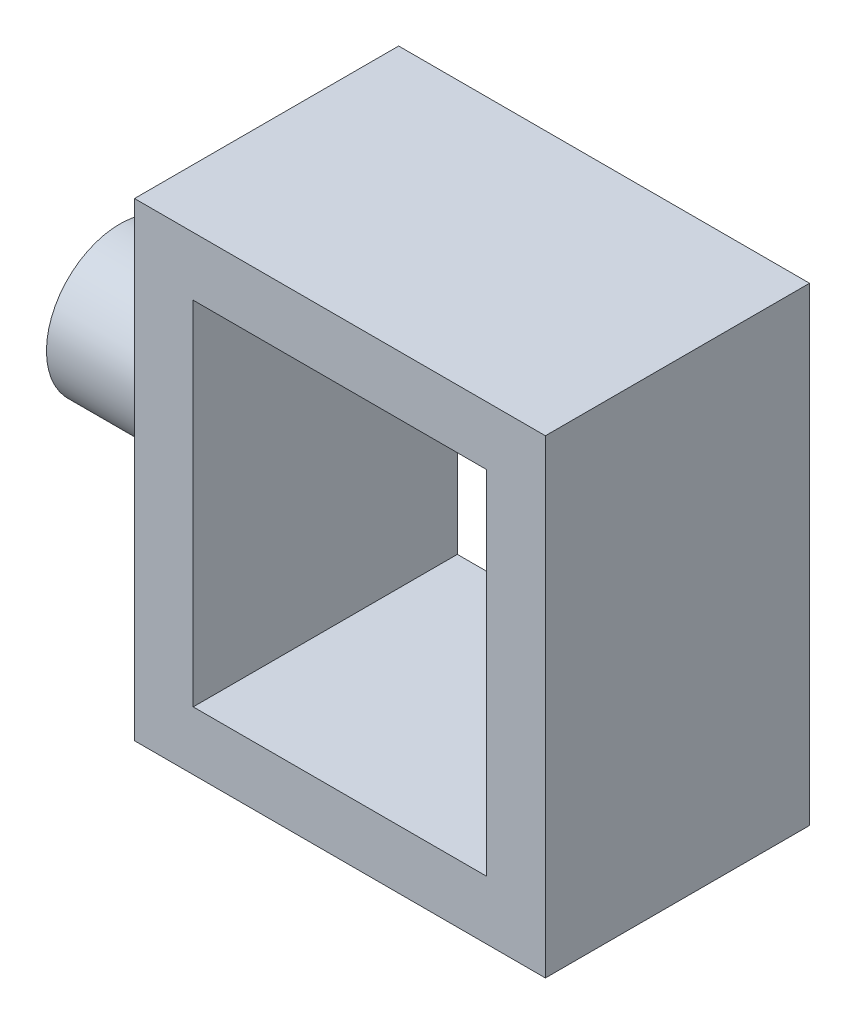
ISO-10303-21;
HEADER;
FILE_DESCRIPTION(('STEP AP214'),'2;1');
FILE_NAME('part.step','',(''),(''),'','','');
FILE_SCHEMA(('AUTOMOTIVE_DESIGN { 1 0 10303 214 1 1 1 1 }'));
ENDSEC;
DATA;
#1=APPLICATION_CONTEXT('core data for automotive mechanical design processes');
#2=APPLICATION_PROTOCOL_DEFINITION('international standard','automotive_design',2000,#1);
#3=PRODUCT_CONTEXT('',#1,'mechanical');
#4=PRODUCT('Part','Part','',(#3));
#5=PRODUCT_RELATED_PRODUCT_CATEGORY('part','',(#4));
#6=PRODUCT_DEFINITION_FORMATION('','',#4);
#7=PRODUCT_DEFINITION_CONTEXT('part definition',#1,'design');
#8=PRODUCT_DEFINITION('design','',#6,#7);
#9=PRODUCT_DEFINITION_SHAPE('','',#8);
#10=(LENGTH_UNIT() NAMED_UNIT(*) SI_UNIT(.MILLI.,.METRE.));
#11=(NAMED_UNIT(*) PLANE_ANGLE_UNIT() SI_UNIT($,.RADIAN.));
#12=(NAMED_UNIT(*) SI_UNIT($,.STERADIAN.) SOLID_ANGLE_UNIT());
#13=UNCERTAINTY_MEASURE_WITH_UNIT(LENGTH_MEASURE(1.E-05),#10,'distance_accuracy_value','');
#14=(GEOMETRIC_REPRESENTATION_CONTEXT(3) GLOBAL_UNCERTAINTY_ASSIGNED_CONTEXT((#13)) GLOBAL_UNIT_ASSIGNED_CONTEXT((#10,
#11,#12)) REPRESENTATION_CONTEXT('',''));
#15=CARTESIAN_POINT('',(0.,0.,0.));
#16=DIRECTION('',(0.,0.,1.));
#17=DIRECTION('',(1.,0.,0.));
#18=AXIS2_PLACEMENT_3D('',#15,#16,#17);
#19=CARTESIAN_POINT('',(0.,0.,9.));
#20=DIRECTION('',(0.,0.,1.));
#21=DIRECTION('',(1.,0.,0.));
#22=AXIS2_PLACEMENT_3D('',#19,#20,#21);
#23=PLANE('',#22);
#24=DIRECTION('',(0.,1.,0.));
#25=VECTOR('',#24,1.);
#26=CARTESIAN_POINT('',(0.,0.,9.));
#27=LINE('',#26,#25);
#28=CARTESIAN_POINT('',(0.,0.,9.));
#29=VERTEX_POINT('',#28);
#30=CARTESIAN_POINT('',(0.,16.,9.));
#31=VERTEX_POINT('',#30);
#32=EDGE_CURVE('E137',#29,#31,#27,.T.);
#33=ORIENTED_EDGE('',*,*,#32,.T.);
#34=DIRECTION('',(-1.,0.,0.));
#35=VECTOR('',#34,1.);
#36=CARTESIAN_POINT('',(0.,16.,9.));
#37=LINE('',#36,#35);
#38=CARTESIAN_POINT('',(-14.,16.,9.));
#39=VERTEX_POINT('',#38);
#40=EDGE_CURVE('E140',#31,#39,#37,.T.);
#41=ORIENTED_EDGE('',*,*,#40,.T.);
#42=DIRECTION('',(0.,-1.,0.));
#43=VECTOR('',#42,1.);
#44=CARTESIAN_POINT('',(-14.,0.,9.));
#45=LINE('',#44,#43);
#46=CARTESIAN_POINT('',(-14.,0.,9.));
#47=VERTEX_POINT('',#46);
#48=EDGE_CURVE('E143',#39,#47,#45,.T.);
#49=ORIENTED_EDGE('',*,*,#48,.T.);
#50=DIRECTION('',(1.,0.,0.));
#51=VECTOR('',#50,1.);
#52=CARTESIAN_POINT('',(0.,0.,9.));
#53=LINE('',#52,#51);
#54=EDGE_CURVE('E145',#47,#29,#53,.T.);
#55=ORIENTED_EDGE('',*,*,#54,.T.);
#56=EDGE_LOOP('',(#33,#41,#49,#55));
#57=FACE_BOUND('',#56,.T.);
#58=DIRECTION('',(1.,0.,0.));
#59=VECTOR('',#58,1.);
#60=CARTESIAN_POINT('',(-12.,2.,9.));
#61=LINE('',#60,#59);
#62=CARTESIAN_POINT('',(-12.,2.,9.));
#63=VERTEX_POINT('',#62);
#64=CARTESIAN_POINT('',(-1.99999999999999,2.,9.));
#65=VERTEX_POINT('',#64);
#66=EDGE_CURVE('E108',#63,#65,#61,.T.);
#67=ORIENTED_EDGE('',*,*,#66,.F.);
#68=DIRECTION('',(0.,-1.,0.));
#69=VECTOR('',#68,1.);
#70=CARTESIAN_POINT('',(-12.,14.,9.));
#71=LINE('',#70,#69);
#72=CARTESIAN_POINT('',(-12.,14.,9.));
#73=VERTEX_POINT('',#72);
#74=EDGE_CURVE('E100',#73,#63,#71,.T.);
#75=ORIENTED_EDGE('',*,*,#74,.F.);
#76=DIRECTION('',(-1.,0.,0.));
#77=VECTOR('',#76,1.);
#78=CARTESIAN_POINT('',(-12.,14.,9.));
#79=LINE('',#78,#77);
#80=CARTESIAN_POINT('',(-1.99999999999999,14.,9.));
#81=VERTEX_POINT('',#80);
#82=EDGE_CURVE('E122',#81,#73,#79,.T.);
#83=ORIENTED_EDGE('',*,*,#82,.F.);
#84=DIRECTION('',(0.,1.,0.));
#85=VECTOR('',#84,1.);
#86=CARTESIAN_POINT('',(-1.99999999999999,14.,9.));
#87=LINE('',#86,#85);
#88=EDGE_CURVE('E120',#65,#81,#87,.T.);
#89=ORIENTED_EDGE('',*,*,#88,.F.);
#90=EDGE_LOOP('',(#67,#75,#83,#89));
#91=FACE_BOUND('',#90,.T.);
#92=ADVANCED_FACE('F34',(#57,#91),#23,.T.);
#93=CARTESIAN_POINT('',(0.,0.,0.));
#94=DIRECTION('',(0.,0.,1.));
#95=DIRECTION('',(1.,0.,0.));
#96=AXIS2_PLACEMENT_3D('',#93,#94,#95);
#97=PLANE('',#96);
#98=DIRECTION('',(0.,1.,0.));
#99=VECTOR('',#98,1.);
#100=CARTESIAN_POINT('',(0.,0.,0.));
#101=LINE('',#100,#99);
#102=CARTESIAN_POINT('',(0.,0.,0.));
#103=VERTEX_POINT('',#102);
#104=CARTESIAN_POINT('',(0.,16.,0.));
#105=VERTEX_POINT('',#104);
#106=EDGE_CURVE('E116',#103,#105,#101,.T.);
#107=ORIENTED_EDGE('',*,*,#106,.F.);
#108=DIRECTION('',(1.,0.,0.));
#109=VECTOR('',#108,1.);
#110=CARTESIAN_POINT('',(0.,0.,0.));
#111=LINE('',#110,#109);
#112=CARTESIAN_POINT('',(-14.,0.,0.));
#113=VERTEX_POINT('',#112);
#114=EDGE_CURVE('E141',#113,#103,#111,.T.);
#115=ORIENTED_EDGE('',*,*,#114,.F.);
#116=DIRECTION('',(0.,-1.,0.));
#117=VECTOR('',#116,1.);
#118=CARTESIAN_POINT('',(-14.,0.,0.));
#119=LINE('',#118,#117);
#120=CARTESIAN_POINT('',(-14.,16.,0.));
#121=VERTEX_POINT('',#120);
#122=EDGE_CURVE('E152',#121,#113,#119,.T.);
#123=ORIENTED_EDGE('',*,*,#122,.F.);
#124=DIRECTION('',(-1.,0.,0.));
#125=VECTOR('',#124,1.);
#126=CARTESIAN_POINT('',(0.,16.,0.));
#127=LINE('',#126,#125);
#128=EDGE_CURVE('E150',#105,#121,#127,.T.);
#129=ORIENTED_EDGE('',*,*,#128,.F.);
#130=EDGE_LOOP('',(#107,#115,#123,#129));
#131=FACE_BOUND('',#130,.T.);
#132=DIRECTION('',(0.,-1.,0.));
#133=VECTOR('',#132,1.);
#134=CARTESIAN_POINT('',(-12.,14.,0.));
#135=LINE('',#134,#133);
#136=CARTESIAN_POINT('',(-12.,14.,0.));
#137=VERTEX_POINT('',#136);
#138=CARTESIAN_POINT('',(-12.,2.,0.));
#139=VERTEX_POINT('',#138);
#140=EDGE_CURVE('E58',#137,#139,#135,.T.);
#141=ORIENTED_EDGE('',*,*,#140,.T.);
#142=DIRECTION('',(1.,0.,0.));
#143=VECTOR('',#142,1.);
#144=CARTESIAN_POINT('',(-12.,2.,0.));
#145=LINE('',#144,#143);
#146=CARTESIAN_POINT('',(-1.99999999999999,2.,0.));
#147=VERTEX_POINT('',#146);
#148=EDGE_CURVE('E115',#139,#147,#145,.T.);
#149=ORIENTED_EDGE('',*,*,#148,.T.);
#150=DIRECTION('',(0.,1.,0.));
#151=VECTOR('',#150,1.);
#152=CARTESIAN_POINT('',(-1.99999999999999,14.,0.));
#153=LINE('',#152,#151);
#154=CARTESIAN_POINT('',(-1.99999999999999,14.,0.));
#155=VERTEX_POINT('',#154);
#156=EDGE_CURVE('E129',#147,#155,#153,.T.);
#157=ORIENTED_EDGE('',*,*,#156,.T.);
#158=DIRECTION('',(-1.,0.,0.));
#159=VECTOR('',#158,1.);
#160=CARTESIAN_POINT('',(-12.,14.,0.));
#161=LINE('',#160,#159);
#162=EDGE_CURVE('E109',#155,#137,#161,.T.);
#163=ORIENTED_EDGE('',*,*,#162,.T.);
#164=EDGE_LOOP('',(#141,#149,#157,#163));
#165=FACE_BOUND('',#164,.T.);
#166=ADVANCED_FACE('F175',(#131,#165),#97,.F.);
#167=CARTESIAN_POINT('',(0.,0.,9.));
#168=DIRECTION('',(-1.,0.,0.));
#169=DIRECTION('',(0.,-1.,0.));
#170=AXIS2_PLACEMENT_3D('',#167,#168,#169);
#171=PLANE('',#170);
#172=ORIENTED_EDGE('',*,*,#106,.T.);
#173=DIRECTION('',(0.,0.,-1.));
#174=VECTOR('',#173,1.);
#175=CARTESIAN_POINT('',(0.,16.,9.));
#176=LINE('',#175,#174);
#177=EDGE_CURVE('E38',#31,#105,#176,.T.);
#178=ORIENTED_EDGE('',*,*,#177,.F.);
#179=ORIENTED_EDGE('',*,*,#32,.F.);
#180=DIRECTION('',(0.,0.,-1.));
#181=VECTOR('',#180,1.);
#182=CARTESIAN_POINT('',(0.,0.,9.));
#183=LINE('',#182,#181);
#184=EDGE_CURVE('E147',#29,#103,#183,.T.);
#185=ORIENTED_EDGE('',*,*,#184,.T.);
#186=EDGE_LOOP('',(#172,#178,#179,#185));
#187=FACE_BOUND('',#186,.T.);
#188=ADVANCED_FACE('F36',(#187),#171,.F.);
#189=CARTESIAN_POINT('',(0.,16.,9.));
#190=DIRECTION('',(0.,-1.,0.));
#191=DIRECTION('',(0.,0.,-1.));
#192=AXIS2_PLACEMENT_3D('',#189,#190,#191);
#193=PLANE('',#192);
#194=ORIENTED_EDGE('',*,*,#128,.T.);
#195=DIRECTION('',(0.,0.,-1.));
#196=VECTOR('',#195,1.);
#197=CARTESIAN_POINT('',(-14.,16.,9.));
#198=LINE('',#197,#196);
#199=EDGE_CURVE('E159',#39,#121,#198,.T.);
#200=ORIENTED_EDGE('',*,*,#199,.F.);
#201=ORIENTED_EDGE('',*,*,#40,.F.);
#202=ORIENTED_EDGE('',*,*,#177,.T.);
#203=EDGE_LOOP('',(#194,#200,#201,#202));
#204=FACE_BOUND('',#203,.T.);
#205=ADVANCED_FACE('F168',(#204),#193,.F.);
#206=CARTESIAN_POINT('',(-14.,0.,9.));
#207=DIRECTION('',(1.,0.,0.));
#208=DIRECTION('',(0.,0.,-1.));
#209=AXIS2_PLACEMENT_3D('',#206,#207,#208);
#210=PLANE('',#209);
#211=CARTESIAN_POINT('',(-14.,7.99999999999999,4.5));
#212=DIRECTION('',(-1.,0.,0.));
#213=DIRECTION('',(0.,0.,1.));
#214=AXIS2_PLACEMENT_3D('',#211,#212,#213);
#215=CIRCLE('',#214,2.5);
#216=CARTESIAN_POINT('',(-14.,7.99999999999999,7.));
#217=VERTEX_POINT('',#216);
#218=EDGE_CURVE('E11',#217,#217,#215,.T.);
#219=ORIENTED_EDGE('',*,*,#218,.F.);
#220=EDGE_LOOP('',(#219));
#221=FACE_BOUND('',#220,.T.);
#222=ORIENTED_EDGE('',*,*,#122,.T.);
#223=DIRECTION('',(0.,0.,-1.));
#224=VECTOR('',#223,1.);
#225=CARTESIAN_POINT('',(-14.,0.,9.));
#226=LINE('',#225,#224);
#227=EDGE_CURVE('E157',#47,#113,#226,.T.);
#228=ORIENTED_EDGE('',*,*,#227,.F.);
#229=ORIENTED_EDGE('',*,*,#48,.F.);
#230=ORIENTED_EDGE('',*,*,#199,.T.);
#231=EDGE_LOOP('',(#222,#228,#229,#230));
#232=FACE_BOUND('',#231,.T.);
#233=ADVANCED_FACE('F178',(#221,#232),#210,.F.);
#234=CARTESIAN_POINT('',(0.,0.,9.));
#235=DIRECTION('',(0.,1.,0.));
#236=DIRECTION('',(-1.,0.,0.));
#237=AXIS2_PLACEMENT_3D('',#234,#235,#236);
#238=PLANE('',#237);
#239=ORIENTED_EDGE('',*,*,#114,.T.);
#240=ORIENTED_EDGE('',*,*,#184,.F.);
#241=ORIENTED_EDGE('',*,*,#54,.F.);
#242=ORIENTED_EDGE('',*,*,#227,.T.);
#243=EDGE_LOOP('',(#239,#240,#241,#242));
#244=FACE_BOUND('',#243,.T.);
#245=ADVANCED_FACE('F181',(#244),#238,.F.);
#246=CARTESIAN_POINT('',(-12.,14.,9.));
#247=DIRECTION('',(1.,0.,0.));
#248=DIRECTION('',(0.,0.,-1.));
#249=AXIS2_PLACEMENT_3D('',#246,#247,#248);
#250=PLANE('',#249);
#251=ORIENTED_EDGE('',*,*,#140,.F.);
#252=DIRECTION('',(0.,0.,-1.));
#253=VECTOR('',#252,1.);
#254=CARTESIAN_POINT('',(-12.,14.,9.));
#255=LINE('',#254,#253);
#256=EDGE_CURVE('E104',#73,#137,#255,.T.);
#257=ORIENTED_EDGE('',*,*,#256,.F.);
#258=ORIENTED_EDGE('',*,*,#74,.T.);
#259=DIRECTION('',(0.,0.,-1.));
#260=VECTOR('',#259,1.);
#261=CARTESIAN_POINT('',(-12.,2.,9.));
#262=LINE('',#261,#260);
#263=EDGE_CURVE('E103',#63,#139,#262,.T.);
#264=ORIENTED_EDGE('',*,*,#263,.T.);
#265=EDGE_LOOP('',(#251,#257,#258,#264));
#266=FACE_BOUND('',#265,.T.);
#267=ADVANCED_FACE('F102',(#266),#250,.T.);
#268=CARTESIAN_POINT('',(-12.,2.,9.));
#269=DIRECTION('',(0.,1.,0.));
#270=DIRECTION('',(0.,0.,1.));
#271=AXIS2_PLACEMENT_3D('',#268,#269,#270);
#272=PLANE('',#271);
#273=ORIENTED_EDGE('',*,*,#148,.F.);
#274=ORIENTED_EDGE('',*,*,#263,.F.);
#275=ORIENTED_EDGE('',*,*,#66,.T.);
#276=DIRECTION('',(0.,0.,-1.));
#277=VECTOR('',#276,1.);
#278=CARTESIAN_POINT('',(-1.99999999999999,2.,9.));
#279=LINE('',#278,#277);
#280=EDGE_CURVE('E117',#65,#147,#279,.T.);
#281=ORIENTED_EDGE('',*,*,#280,.T.);
#282=EDGE_LOOP('',(#273,#274,#275,#281));
#283=FACE_BOUND('',#282,.T.);
#284=ADVANCED_FACE('F112',(#283),#272,.T.);
#285=CARTESIAN_POINT('',(-1.99999999999999,14.,9.));
#286=DIRECTION('',(-1.,0.,0.));
#287=DIRECTION('',(0.,-1.,0.));
#288=AXIS2_PLACEMENT_3D('',#285,#286,#287);
#289=PLANE('',#288);
#290=ORIENTED_EDGE('',*,*,#156,.F.);
#291=ORIENTED_EDGE('',*,*,#280,.F.);
#292=ORIENTED_EDGE('',*,*,#88,.T.);
#293=DIRECTION('',(0.,0.,-1.));
#294=VECTOR('',#293,1.);
#295=CARTESIAN_POINT('',(-1.99999999999999,14.,9.));
#296=LINE('',#295,#294);
#297=EDGE_CURVE('E50',#81,#155,#296,.T.);
#298=ORIENTED_EDGE('',*,*,#297,.T.);
#299=EDGE_LOOP('',(#290,#291,#292,#298));
#300=FACE_BOUND('',#299,.T.);
#301=ADVANCED_FACE('F245',(#300),#289,.T.);
#302=CARTESIAN_POINT('',(-12.,14.,9.));
#303=DIRECTION('',(0.,-1.,0.));
#304=DIRECTION('',(0.,0.,-1.));
#305=AXIS2_PLACEMENT_3D('',#302,#303,#304);
#306=PLANE('',#305);
#307=ORIENTED_EDGE('',*,*,#162,.F.);
#308=ORIENTED_EDGE('',*,*,#297,.F.);
#309=ORIENTED_EDGE('',*,*,#82,.T.);
#310=ORIENTED_EDGE('',*,*,#256,.T.);
#311=EDGE_LOOP('',(#307,#308,#309,#310));
#312=FACE_BOUND('',#311,.T.);
#313=ADVANCED_FACE('F252',(#312),#306,.T.);
#314=CARTESIAN_POINT('',(-19.,7.99999999999999,4.5));
#315=DIRECTION('',(-1.,0.,0.));
#316=DIRECTION('',(0.,0.,1.));
#317=AXIS2_PLACEMENT_3D('',#314,#315,#316);
#318=PLANE('',#317);
#319=CARTESIAN_POINT('',(-19.,7.99999999999999,4.5));
#320=DIRECTION('',(-1.,0.,0.));
#321=DIRECTION('',(0.,0.,1.));
#322=AXIS2_PLACEMENT_3D('',#319,#320,#321);
#323=CIRCLE('',#322,2.5);
#324=CARTESIAN_POINT('',(-19.,7.99999999999999,7.));
#325=VERTEX_POINT('',#324);
#326=EDGE_CURVE('E127',#325,#325,#323,.T.);
#327=ORIENTED_EDGE('',*,*,#326,.T.);
#328=EDGE_LOOP('',(#327));
#329=FACE_BOUND('',#328,.T.);
#330=CARTESIAN_POINT('',(-19.,7.99999999999999,4.5));
#331=DIRECTION('',(-1.,0.,0.));
#332=DIRECTION('',(0.,0.,1.));
#333=AXIS2_PLACEMENT_3D('',#330,#331,#332);
#334=CIRCLE('',#333,0.500000000000001);
#335=CARTESIAN_POINT('',(-19.,7.99999999999999,5.));
#336=VERTEX_POINT('',#335);
#337=EDGE_CURVE('E307',#336,#336,#334,.T.);
#338=ORIENTED_EDGE('',*,*,#337,.F.);
#339=EDGE_LOOP('',(#338));
#340=FACE_BOUND('',#339,.T.);
#341=ADVANCED_FACE('F260',(#329,#340),#318,.T.);
#342=CARTESIAN_POINT('',(-19.,7.99999999999999,4.5));
#343=DIRECTION('',(1.,0.,0.));
#344=DIRECTION('',(0.,0.,-1.));
#345=AXIS2_PLACEMENT_3D('',#342,#343,#344);
#346=CYLINDRICAL_SURFACE('',#345,2.5);
#347=ORIENTED_EDGE('',*,*,#326,.F.);
#348=EDGE_LOOP('',(#347));
#349=FACE_BOUND('',#348,.T.);
#350=ORIENTED_EDGE('',*,*,#218,.T.);
#351=EDGE_LOOP('',(#350));
#352=FACE_BOUND('',#351,.T.);
#353=ADVANCED_FACE('F276',(#349,#352),#346,.T.);
#354=CARTESIAN_POINT('',(-19.,7.99999999999999,4.5));
#355=DIRECTION('',(1.,0.,0.));
#356=DIRECTION('',(0.,0.,-1.));
#357=AXIS2_PLACEMENT_3D('',#354,#355,#356);
#358=CYLINDRICAL_SURFACE('',#357,0.500000000000001);
#359=ORIENTED_EDGE('',*,*,#337,.T.);
#360=EDGE_LOOP('',(#359));
#361=FACE_BOUND('',#360,.T.);
#362=CARTESIAN_POINT('',(-14.,7.99999999999999,4.5));
#363=DIRECTION('',(-1.,0.,0.));
#364=DIRECTION('',(0.,0.,1.));
#365=AXIS2_PLACEMENT_3D('',#362,#363,#364);
#366=CIRCLE('',#365,0.500000000000001);
#367=CARTESIAN_POINT('',(-14.,7.99999999999999,5.));
#368=VERTEX_POINT('',#367);
#369=EDGE_CURVE('E310',#368,#368,#366,.T.);
#370=ORIENTED_EDGE('',*,*,#369,.F.);
#371=EDGE_LOOP('',(#370));
#372=FACE_BOUND('',#371,.T.);
#373=ADVANCED_FACE('F268',(#361,#372),#358,.F.);
#374=ORIENTED_EDGE('',*,*,#369,.T.);
#375=EDGE_LOOP('',(#374));
#376=FACE_BOUND('',#375,.T.);
#377=ADVANCED_FACE('F196',(#376),#210,.F.);
#378=CLOSED_SHELL('',(#92,#166,#188,#205,#233,#245,#267,#284,#301,#313,#341,#353,#373,#377));
#379=MANIFOLD_SOLID_BREP('B2',#378);
#380=ADVANCED_BREP_SHAPE_REPRESENTATION('',(#18,#379),#14);
#381=SHAPE_DEFINITION_REPRESENTATION(#9,#380);
ENDSEC;
END-ISO-10303-21;
